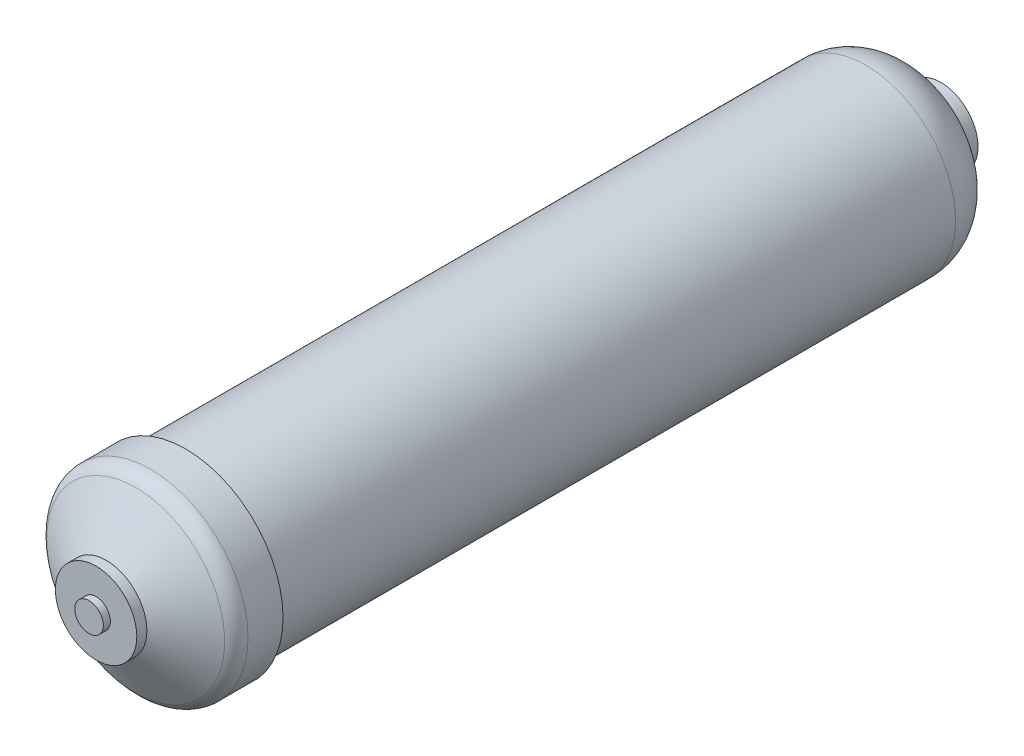
ISO-10303-21;
HEADER;
FILE_DESCRIPTION(('STEP AP214'),'2;1');
FILE_NAME('part.step','',(''),(''),'','','');
FILE_SCHEMA(('AUTOMOTIVE_DESIGN { 1 0 10303 214 1 1 1 1 }'));
ENDSEC;
DATA;
#1=APPLICATION_CONTEXT('core data for automotive mechanical design processes');
#2=APPLICATION_PROTOCOL_DEFINITION('international standard','automotive_design',2000,#1);
#3=PRODUCT_CONTEXT('',#1,'mechanical');
#4=PRODUCT('Part','Part','',(#3));
#5=PRODUCT_RELATED_PRODUCT_CATEGORY('part','',(#4));
#6=PRODUCT_DEFINITION_FORMATION('','',#4);
#7=PRODUCT_DEFINITION_CONTEXT('part definition',#1,'design');
#8=PRODUCT_DEFINITION('design','',#6,#7);
#9=PRODUCT_DEFINITION_SHAPE('','',#8);
#10=(LENGTH_UNIT() NAMED_UNIT(*) SI_UNIT(.MILLI.,.METRE.));
#11=(NAMED_UNIT(*) PLANE_ANGLE_UNIT() SI_UNIT($,.RADIAN.));
#12=(NAMED_UNIT(*) SI_UNIT($,.STERADIAN.) SOLID_ANGLE_UNIT());
#13=UNCERTAINTY_MEASURE_WITH_UNIT(LENGTH_MEASURE(1.E-05),#10,'distance_accuracy_value','');
#14=(GEOMETRIC_REPRESENTATION_CONTEXT(3) GLOBAL_UNCERTAINTY_ASSIGNED_CONTEXT((#13)) GLOBAL_UNIT_ASSIGNED_CONTEXT((#10,
#11,#12)) REPRESENTATION_CONTEXT('',''));
#15=CARTESIAN_POINT('',(0.,0.,0.));
#16=DIRECTION('',(0.,0.,1.));
#17=DIRECTION('',(1.,0.,0.));
#18=AXIS2_PLACEMENT_3D('',#15,#16,#17);
#19=CARTESIAN_POINT('',(0.,0.,35.0151923080179));
#20=DIRECTION('',(0.,0.,1.));
#21=DIRECTION('',(1.,0.,0.));
#22=AXIS2_PLACEMENT_3D('',#19,#20,#21);
#23=PLANE('',#22);
#24=CARTESIAN_POINT('',(0.,0.,35.0151923080179));
#25=DIRECTION('',(0.,0.,1.));
#26=DIRECTION('',(1.,0.,0.));
#27=AXIS2_PLACEMENT_3D('',#24,#25,#26);
#28=CIRCLE('',#27,5.1761337609263);
#29=CARTESIAN_POINT('',(5.1761337609263,0.,35.0151923080179));
#30=VERTEX_POINT('',#29);
#31=EDGE_CURVE('E18',#30,#30,#28,.F.);
#32=ORIENTED_EDGE('',*,*,#31,.F.);
#33=EDGE_LOOP('',(#32));
#34=FACE_BOUND('',#33,.T.);
#35=ADVANCED_FACE('F14',(#34),#23,.T.);
#36=CARTESIAN_POINT('',(0.,0.,32.4751923080179));
#37=DIRECTION('',(0.,0.,1.));
#38=DIRECTION('',(1.,0.,0.));
#39=AXIS2_PLACEMENT_3D('',#36,#37,#38);
#40=CYLINDRICAL_SURFACE('',#39,5.1761337609263);
#41=CARTESIAN_POINT('',(0.,0.,32.4751923080179));
#42=DIRECTION('',(0.,0.,1.));
#43=DIRECTION('',(1.,0.,0.));
#44=AXIS2_PLACEMENT_3D('',#41,#42,#43);
#45=CIRCLE('',#44,5.1761337609263);
#46=CARTESIAN_POINT('',(5.1761337609263,0.,32.4751923080179));
#47=VERTEX_POINT('',#46);
#48=EDGE_CURVE('E126',#47,#47,#45,.F.);
#49=ORIENTED_EDGE('',*,*,#48,.F.);
#50=EDGE_LOOP('',(#49));
#51=FACE_BOUND('',#50,.T.);
#52=ORIENTED_EDGE('',*,*,#31,.T.);
#53=EDGE_LOOP('',(#52));
#54=FACE_BOUND('',#53,.T.);
#55=ADVANCED_FACE('F73',(#51,#54),#40,.T.);
#56=CARTESIAN_POINT('',(0.,0.,32.4751923080179));
#57=DIRECTION('',(0.,0.,1.));
#58=DIRECTION('',(1.,0.,0.));
#59=AXIS2_PLACEMENT_3D('',#56,#57,#58);
#60=PLANE('',#59);
#61=ORIENTED_EDGE('',*,*,#48,.T.);
#62=EDGE_LOOP('',(#61));
#63=FACE_BOUND('',#62,.T.);
#64=CARTESIAN_POINT('',(0.,0.,32.4751923080179));
#65=DIRECTION('',(0.,0.,1.));
#66=DIRECTION('',(1.,0.,0.));
#67=AXIS2_PLACEMENT_3D('',#64,#65,#66);
#68=CIRCLE('',#67,14.7580737472888);
#69=CARTESIAN_POINT('',(14.7580737472888,0.,32.4751923080179));
#70=VERTEX_POINT('',#69);
#71=EDGE_CURVE('E124',#70,#70,#68,.F.);
#72=ORIENTED_EDGE('',*,*,#71,.F.);
#73=EDGE_LOOP('',(#72));
#74=FACE_BOUND('',#73,.T.);
#75=ADVANCED_FACE('F69',(#63,#74),#60,.T.);
#76=CARTESIAN_POINT('',(0.,0.,28.8175923080179));
#77=DIRECTION('',(0.,0.,1.));
#78=DIRECTION('',(1.,0.,0.));
#79=AXIS2_PLACEMENT_3D('',#76,#77,#78);
#80=CYLINDRICAL_SURFACE('',#79,14.7580737472888);
#81=CARTESIAN_POINT('',(0.,0.,28.8175923079888));
#82=DIRECTION('',(0.,0.,-1.));
#83=DIRECTION('',(0.,1.,0.));
#84=AXIS2_PLACEMENT_3D('',#81,#82,#83);
#85=CIRCLE('',#84,14.7580737472711);
#86=CARTESIAN_POINT('',(0.,14.7580737472711,28.8175923079888));
#87=VERTEX_POINT('',#86);
#88=EDGE_CURVE('E123',#87,#87,#85,.T.);
#89=ORIENTED_EDGE('',*,*,#88,.F.);
#90=EDGE_LOOP('',(#89));
#91=FACE_BOUND('',#90,.T.);
#92=ORIENTED_EDGE('',*,*,#71,.T.);
#93=EDGE_LOOP('',(#92));
#94=FACE_BOUND('',#93,.T.);
#95=ADVANCED_FACE('F65',(#91,#94),#80,.T.);
#96=CARTESIAN_POINT('',(0.,0.,-276.3774));
#97=DIRECTION('',(0.,0.,1.));
#98=DIRECTION('',(1.,0.,0.));
#99=AXIS2_PLACEMENT_3D('',#96,#97,#98);
#100=PLANE('',#99);
#101=CARTESIAN_POINT('',(0.,0.,-276.3774));
#102=DIRECTION('',(0.,0.,-1.));
#103=DIRECTION('',(-1.,0.,0.));
#104=AXIS2_PLACEMENT_3D('',#101,#102,#103);
#105=CIRCLE('',#104,5.1761337609263);
#106=CARTESIAN_POINT('',(-5.1761337609263,0.,-276.3774));
#107=VERTEX_POINT('',#106);
#108=EDGE_CURVE('E120',#107,#107,#105,.F.);
#109=ORIENTED_EDGE('',*,*,#108,.F.);
#110=EDGE_LOOP('',(#109));
#111=FACE_BOUND('',#110,.T.);
#112=ADVANCED_FACE('F61',(#111),#100,.F.);
#113=CARTESIAN_POINT('',(0.,0.,18.1184461553335));
#114=DIRECTION('',(0.,0.,-1.));
#115=DIRECTION('',(-1.,0.,0.));
#116=AXIS2_PLACEMENT_3D('',#113,#114,#115);
#117=CONICAL_SURFACE('',#116,32.2670332620173,1.02227909219458);
#118=CARTESIAN_POINT('',(0.,0.,18.1184461553044));
#119=DIRECTION('',(0.,0.,-1.));
#120=DIRECTION('',(-1.,0.,0.));
#121=AXIS2_PLACEMENT_3D('',#118,#119,#120);
#122=CIRCLE('',#121,32.2670332619995);
#123=CARTESIAN_POINT('',(-32.2670332619995,0.,18.1184461553044));
#124=VERTEX_POINT('',#123);
#125=EDGE_CURVE('E44',#124,#124,#122,.T.);
#126=ORIENTED_EDGE('',*,*,#125,.F.);
#127=EDGE_LOOP('',(#126));
#128=FACE_BOUND('',#127,.T.);
#129=ORIENTED_EDGE('',*,*,#88,.T.);
#130=EDGE_LOOP('',(#129));
#131=FACE_BOUND('',#130,.T.);
#132=ADVANCED_FACE('F57',(#128,#131),#117,.T.);
#133=CARTESIAN_POINT('',(0.,0.,-273.8374));
#134=DIRECTION('',(0.,0.,-1.));
#135=DIRECTION('',(-1.,0.,0.));
#136=AXIS2_PLACEMENT_3D('',#133,#134,#135);
#137=CYLINDRICAL_SURFACE('',#136,5.1761337609263);
#138=CARTESIAN_POINT('',(0.,0.,-273.8374));
#139=DIRECTION('',(0.,0.,-1.));
#140=DIRECTION('',(-1.,0.,0.));
#141=AXIS2_PLACEMENT_3D('',#138,#139,#140);
#142=CIRCLE('',#141,5.1761337609263);
#143=CARTESIAN_POINT('',(-5.1761337609263,0.,-273.8374));
#144=VERTEX_POINT('',#143);
#145=EDGE_CURVE('E39',#144,#144,#142,.T.);
#146=ORIENTED_EDGE('',*,*,#145,.T.);
#147=EDGE_LOOP('',(#146));
#148=FACE_BOUND('',#147,.T.);
#149=ORIENTED_EDGE('',*,*,#108,.T.);
#150=EDGE_LOOP('',(#149));
#151=FACE_BOUND('',#150,.T.);
#152=ADVANCED_FACE('F52',(#148,#151),#137,.T.);
#153=CARTESIAN_POINT('',(0.,0.,12.7));
#154=DIRECTION('',(0.,0.,-1.));
#155=DIRECTION('',(-1.,0.,0.));
#156=AXIS2_PLACEMENT_3D('',#153,#154,#155);
#157=TOROIDAL_SURFACE('',#156,28.956,6.35);
#158=CARTESIAN_POINT('',(0.,0.,12.7));
#159=DIRECTION('',(0.,0.,-1.));
#160=DIRECTION('',(-1.,0.,0.));
#161=AXIS2_PLACEMENT_3D('',#158,#159,#160);
#162=CIRCLE('',#161,35.306);
#163=CARTESIAN_POINT('',(-35.306,0.,12.7));
#164=VERTEX_POINT('',#163);
#165=EDGE_CURVE('E35',#164,#164,#162,.T.);
#166=ORIENTED_EDGE('',*,*,#165,.F.);
#167=EDGE_LOOP('',(#166));
#168=FACE_BOUND('',#167,.T.);
#169=ORIENTED_EDGE('',*,*,#125,.T.);
#170=EDGE_LOOP('',(#169));
#171=FACE_BOUND('',#170,.T.);
#172=ADVANCED_FACE('F47',(#168,#171),#157,.T.);
#173=CARTESIAN_POINT('',(0.,0.,-273.8374));
#174=DIRECTION('',(0.,0.,1.));
#175=DIRECTION('',(1.,0.,0.));
#176=AXIS2_PLACEMENT_3D('',#173,#174,#175);
#177=PLANE('',#176);
#178=ORIENTED_EDGE('',*,*,#145,.F.);
#179=EDGE_LOOP('',(#178));
#180=FACE_BOUND('',#179,.T.);
#181=CARTESIAN_POINT('',(0.,0.,-273.8374));
#182=DIRECTION('',(0.,0.,-1.));
#183=DIRECTION('',(-1.,0.,0.));
#184=AXIS2_PLACEMENT_3D('',#181,#182,#183);
#185=CIRCLE('',#184,13.462);
#186=CARTESIAN_POINT('',(-13.462,0.,-273.8374));
#187=VERTEX_POINT('',#186);
#188=EDGE_CURVE('E38',#187,#187,#185,.F.);
#189=ORIENTED_EDGE('',*,*,#188,.F.);
#190=EDGE_LOOP('',(#189));
#191=FACE_BOUND('',#190,.T.);
#192=ADVANCED_FACE('F51',(#180,#191),#177,.F.);
#193=CARTESIAN_POINT('',(0.,0.,9.525));
#194=DIRECTION('',(0.,0.,-1.));
#195=DIRECTION('',(-1.,0.,0.));
#196=AXIS2_PLACEMENT_3D('',#193,#194,#195);
#197=CYLINDRICAL_SURFACE('',#196,35.306);
#198=ORIENTED_EDGE('',*,*,#165,.T.);
#199=EDGE_LOOP('',(#198));
#200=FACE_BOUND('',#199,.T.);
#201=CARTESIAN_POINT('',(0.,0.,0.));
#202=DIRECTION('',(0.,0.,-1.));
#203=DIRECTION('',(-1.,0.,0.));
#204=AXIS2_PLACEMENT_3D('',#201,#202,#203);
#205=CIRCLE('',#204,35.306);
#206=CARTESIAN_POINT('',(-35.306,0.,0.));
#207=VERTEX_POINT('',#206);
#208=EDGE_CURVE('E110',#207,#207,#205,.T.);
#209=ORIENTED_EDGE('',*,*,#208,.F.);
#210=EDGE_LOOP('',(#209));
#211=FACE_BOUND('',#210,.T.);
#212=ADVANCED_FACE('F98',(#200,#211),#197,.T.);
#213=CARTESIAN_POINT('',(0.,0.,-265.6586));
#214=DIRECTION('',(0.,0.,-1.));
#215=DIRECTION('',(-1.,0.,0.));
#216=AXIS2_PLACEMENT_3D('',#213,#214,#215);
#217=CYLINDRICAL_SURFACE('',#216,13.462);
#218=CARTESIAN_POINT('',(0.,0.,-265.6586));
#219=DIRECTION('',(0.,0.,-1.));
#220=DIRECTION('',(-1.,0.,0.));
#221=AXIS2_PLACEMENT_3D('',#218,#219,#220);
#222=CIRCLE('',#221,13.462);
#223=CARTESIAN_POINT('',(-13.462,0.,-265.6586));
#224=VERTEX_POINT('',#223);
#225=EDGE_CURVE('E27',#224,#224,#222,.T.);
#226=ORIENTED_EDGE('',*,*,#225,.T.);
#227=EDGE_LOOP('',(#226));
#228=FACE_BOUND('',#227,.T.);
#229=ORIENTED_EDGE('',*,*,#188,.T.);
#230=EDGE_LOOP('',(#229));
#231=FACE_BOUND('',#230,.T.);
#232=ADVANCED_FACE('F95',(#228,#231),#217,.T.);
#233=CARTESIAN_POINT('',(0.,0.,0.));
#234=DIRECTION('',(0.,0.,-1.));
#235=DIRECTION('',(-1.,0.,0.));
#236=AXIS2_PLACEMENT_3D('',#233,#234,#235);
#237=PLANE('',#236);
#238=CARTESIAN_POINT('',(0.,0.,0.));
#239=DIRECTION('',(0.,0.,-1.));
#240=DIRECTION('',(-1.,0.,0.));
#241=AXIS2_PLACEMENT_3D('',#238,#239,#240);
#242=CIRCLE('',#241,32.512);
#243=CARTESIAN_POINT('',(-32.512,0.,0.));
#244=VERTEX_POINT('',#243);
#245=EDGE_CURVE('E22',#244,#244,#242,.T.);
#246=ORIENTED_EDGE('',*,*,#245,.F.);
#247=EDGE_LOOP('',(#246));
#248=FACE_BOUND('',#247,.T.);
#249=ORIENTED_EDGE('',*,*,#208,.T.);
#250=EDGE_LOOP('',(#249));
#251=FACE_BOUND('',#250,.T.);
#252=ADVANCED_FACE('F89',(#248,#251),#237,.T.);
#253=CARTESIAN_POINT('',(0.,0.,-246.6086));
#254=DIRECTION('',(0.,0.,-1.));
#255=DIRECTION('',(-1.,0.,0.));
#256=AXIS2_PLACEMENT_3D('',#253,#254,#255);
#257=DEGENERATE_TOROIDAL_SURFACE('',#256,13.4620000000001,19.05,.T.);
#258=CARTESIAN_POINT('',(0.,0.,-246.6086));
#259=DIRECTION('',(0.,0.,-1.));
#260=DIRECTION('',(-1.,0.,0.));
#261=AXIS2_PLACEMENT_3D('',#258,#259,#260);
#262=CIRCLE('',#261,32.512);
#263=CARTESIAN_POINT('',(-32.512,0.,-246.6086));
#264=VERTEX_POINT('',#263);
#265=EDGE_CURVE('E9',#264,#264,#262,.F.);
#266=ORIENTED_EDGE('',*,*,#265,.F.);
#267=EDGE_LOOP('',(#266));
#268=FACE_BOUND('',#267,.T.);
#269=ORIENTED_EDGE('',*,*,#225,.F.);
#270=EDGE_LOOP('',(#269));
#271=FACE_BOUND('',#270,.T.);
#272=ADVANCED_FACE('F16',(#268,#271),#257,.T.);
#273=CARTESIAN_POINT('',(0.,0.,-132.8293));
#274=DIRECTION('',(0.,0.,-1.));
#275=DIRECTION('',(-1.,0.,0.));
#276=AXIS2_PLACEMENT_3D('',#273,#274,#275);
#277=CYLINDRICAL_SURFACE('',#276,32.512);
#278=ORIENTED_EDGE('',*,*,#265,.T.);
#279=EDGE_LOOP('',(#278));
#280=FACE_BOUND('',#279,.T.);
#281=ORIENTED_EDGE('',*,*,#245,.T.);
#282=EDGE_LOOP('',(#281));
#283=FACE_BOUND('',#282,.T.);
#284=ADVANCED_FACE('F83',(#280,#283),#277,.T.);
#285=CLOSED_SHELL('',(#35,#55,#75,#95,#112,#132,#152,#172,#192,#212,#232,#252,#272,#284));
#286=MANIFOLD_SOLID_BREP('B1',#285);
#287=ADVANCED_BREP_SHAPE_REPRESENTATION('',(#18,#286),#14);
#288=SHAPE_DEFINITION_REPRESENTATION(#9,#287);
ENDSEC;
END-ISO-10303-21;
